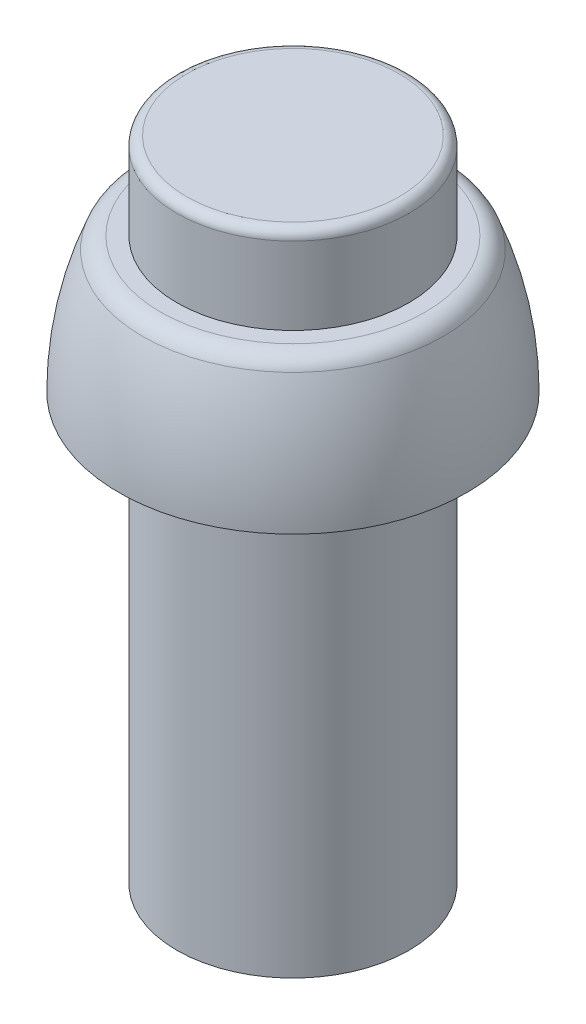
ISO-10303-21;
HEADER;
FILE_DESCRIPTION(('STEP AP214'),'2;1');
FILE_NAME('part.step','',(''),(''),'','','');
FILE_SCHEMA(('AUTOMOTIVE_DESIGN { 1 0 10303 214 1 1 1 1 }'));
ENDSEC;
DATA;
#1=APPLICATION_CONTEXT('core data for automotive mechanical design processes');
#2=APPLICATION_PROTOCOL_DEFINITION('international standard','automotive_design',2000,#1);
#3=PRODUCT_CONTEXT('',#1,'mechanical');
#4=PRODUCT('Part','Part','',(#3));
#5=PRODUCT_RELATED_PRODUCT_CATEGORY('part','',(#4));
#6=PRODUCT_DEFINITION_FORMATION('','',#4);
#7=PRODUCT_DEFINITION_CONTEXT('part definition',#1,'design');
#8=PRODUCT_DEFINITION('design','',#6,#7);
#9=PRODUCT_DEFINITION_SHAPE('','',#8);
#10=(LENGTH_UNIT() NAMED_UNIT(*) SI_UNIT(.MILLI.,.METRE.));
#11=(NAMED_UNIT(*) PLANE_ANGLE_UNIT() SI_UNIT($,.RADIAN.));
#12=(NAMED_UNIT(*) SI_UNIT($,.STERADIAN.) SOLID_ANGLE_UNIT());
#13=UNCERTAINTY_MEASURE_WITH_UNIT(LENGTH_MEASURE(1.E-05),#10,'distance_accuracy_value','');
#14=(GEOMETRIC_REPRESENTATION_CONTEXT(3) GLOBAL_UNCERTAINTY_ASSIGNED_CONTEXT((#13)) GLOBAL_UNIT_ASSIGNED_CONTEXT((#10,
#11,#12)) REPRESENTATION_CONTEXT('',''));
#15=CARTESIAN_POINT('',(0.,0.,0.));
#16=DIRECTION('',(0.,0.,1.));
#17=DIRECTION('',(1.,0.,0.));
#18=AXIS2_PLACEMENT_3D('',#15,#16,#17);
#19=CARTESIAN_POINT('',(0.,-22.,0.));
#20=DIRECTION('',(0.,1.,0.));
#21=DIRECTION('',(0.,0.,1.));
#22=AXIS2_PLACEMENT_3D('',#19,#20,#21);
#23=CYLINDRICAL_SURFACE('',#22,6.);
#24=CARTESIAN_POINT('',(0.,-22.,0.));
#25=DIRECTION('',(0.,1.,0.));
#26=DIRECTION('',(0.,0.,1.));
#27=AXIS2_PLACEMENT_3D('',#24,#25,#26);
#28=CIRCLE('',#27,6.);
#29=CARTESIAN_POINT('',(0.,-22.,6.));
#30=VERTEX_POINT('',#29);
#31=EDGE_CURVE('E73',#30,#30,#28,.T.);
#32=ORIENTED_EDGE('',*,*,#31,.T.);
#33=EDGE_LOOP('',(#32));
#34=FACE_BOUND('',#33,.T.);
#35=CARTESIAN_POINT('',(0.,0.,0.));
#36=DIRECTION('',(0.,1.,0.));
#37=DIRECTION('',(0.,0.,1.));
#38=AXIS2_PLACEMENT_3D('',#35,#36,#37);
#39=CIRCLE('',#38,6.);
#40=CARTESIAN_POINT('',(0.,0.,6.));
#41=VERTEX_POINT('',#40);
#42=EDGE_CURVE('E78',#41,#41,#39,.T.);
#43=ORIENTED_EDGE('',*,*,#42,.F.);
#44=EDGE_LOOP('',(#43));
#45=FACE_BOUND('',#44,.T.);
#46=ADVANCED_FACE('F50',(#34,#45),#23,.T.);
#47=CARTESIAN_POINT('',(0.,-22.,0.));
#48=DIRECTION('',(0.,1.,0.));
#49=DIRECTION('',(0.,0.,1.));
#50=AXIS2_PLACEMENT_3D('',#47,#48,#49);
#51=PLANE('',#50);
#52=ORIENTED_EDGE('',*,*,#31,.F.);
#53=EDGE_LOOP('',(#52));
#54=FACE_BOUND('',#53,.T.);
#55=ADVANCED_FACE('F105',(#54),#51,.F.);
#56=CARTESIAN_POINT('',(0.,0.,0.));
#57=DIRECTION('',(0.,-1.,0.));
#58=DIRECTION('',(0.,0.,-1.));
#59=AXIS2_PLACEMENT_3D('',#56,#57,#58);
#60=PLANE('',#59);
#61=ORIENTED_EDGE('',*,*,#42,.T.);
#62=EDGE_LOOP('',(#61));
#63=FACE_BOUND('',#62,.T.);
#64=CARTESIAN_POINT('',(0.,0.,0.));
#65=DIRECTION('',(0.,-1.,0.));
#66=DIRECTION('',(0.,0.,-1.));
#67=AXIS2_PLACEMENT_3D('',#64,#65,#66);
#68=CIRCLE('',#67,9.);
#69=CARTESIAN_POINT('',(0.,0.,-9.));
#70=VERTEX_POINT('',#69);
#71=EDGE_CURVE('E77',#70,#70,#68,.T.);
#72=ORIENTED_EDGE('',*,*,#71,.T.);
#73=EDGE_LOOP('',(#72));
#74=FACE_BOUND('',#73,.T.);
#75=ADVANCED_FACE('F86',(#63,#74),#60,.T.);
#76=CARTESIAN_POINT('',(0.,0.,0.));
#77=DIRECTION('',(0.,-1.,0.));
#78=DIRECTION('',(0.,0.,-1.));
#79=AXIS2_PLACEMENT_3D('',#76,#77,#78);
#80=DEGENERATE_TOROIDAL_SURFACE('',#79,8.08333333333334,17.0833333333333,.F.);
#81=CARTESIAN_POINT('',(0.,6.37305699481865,0.));
#82=DIRECTION('',(0.,-1.,0.));
#83=DIRECTION('',(0.,0.,-1.));
#84=AXIS2_PLACEMENT_3D('',#81,#82,#83);
#85=CIRCLE('',#84,7.76672730751504);
#86=CARTESIAN_POINT('',(0.,6.37305699481865,-7.76672730751504));
#87=VERTEX_POINT('',#86);
#88=EDGE_CURVE('E72',#87,#87,#85,.T.);
#89=ORIENTED_EDGE('',*,*,#88,.T.);
#90=EDGE_LOOP('',(#89));
#91=FACE_BOUND('',#90,.T.);
#92=ORIENTED_EDGE('',*,*,#71,.F.);
#93=EDGE_LOOP('',(#92));
#94=FACE_BOUND('',#93,.T.);
#95=ADVANCED_FACE('F89',(#91,#94),#80,.F.);
#96=CARTESIAN_POINT('',(0.,7.,0.));
#97=DIRECTION('',(0.,1.,0.));
#98=DIRECTION('',(0.,0.,1.));
#99=AXIS2_PLACEMENT_3D('',#96,#97,#98);
#100=PLANE('',#99);
#101=CARTESIAN_POINT('',(0.,7.,0.));
#102=DIRECTION('',(0.,1.,0.));
#103=DIRECTION('',(0.,0.,1.));
#104=AXIS2_PLACEMENT_3D('',#101,#102,#103);
#105=CIRCLE('',#104,6.);
#106=CARTESIAN_POINT('',(0.,7.,6.));
#107=VERTEX_POINT('',#106);
#108=EDGE_CURVE('E58',#107,#107,#105,.T.);
#109=ORIENTED_EDGE('',*,*,#108,.F.);
#110=EDGE_LOOP('',(#109));
#111=FACE_BOUND('',#110,.T.);
#112=CARTESIAN_POINT('',(0.,7.,0.));
#113=DIRECTION('',(0.,1.,0.));
#114=DIRECTION('',(0.,0.,1.));
#115=AXIS2_PLACEMENT_3D('',#112,#113,#114);
#116=CIRCLE('',#115,6.83891887975806);
#117=CARTESIAN_POINT('',(0.,7.,6.83891887975806));
#118=VERTEX_POINT('',#117);
#119=EDGE_CURVE('E62',#118,#118,#116,.T.);
#120=ORIENTED_EDGE('',*,*,#119,.T.);
#121=EDGE_LOOP('',(#120));
#122=FACE_BOUND('',#121,.T.);
#123=ADVANCED_FACE('F95',(#111,#122),#100,.T.);
#124=CARTESIAN_POINT('',(0.,6.,0.));
#125=DIRECTION('',(0.,1.,0.));
#126=DIRECTION('',(0.,0.,1.));
#127=AXIS2_PLACEMENT_3D('',#124,#125,#126);
#128=TOROIDAL_SURFACE('',#127,6.83891887975806,1.);
#129=ORIENTED_EDGE('',*,*,#119,.F.);
#130=EDGE_LOOP('',(#129));
#131=FACE_BOUND('',#130,.T.);
#132=ORIENTED_EDGE('',*,*,#88,.F.);
#133=EDGE_LOOP('',(#132));
#134=FACE_BOUND('',#133,.T.);
#135=ADVANCED_FACE('F97',(#131,#134),#128,.T.);
#136=CARTESIAN_POINT('',(0.,11.5,0.));
#137=DIRECTION('',(0.,1.,0.));
#138=DIRECTION('',(0.,0.,1.));
#139=AXIS2_PLACEMENT_3D('',#136,#137,#138);
#140=PLANE('',#139);
#141=CARTESIAN_POINT('',(0.,11.5,0.));
#142=DIRECTION('',(0.,1.,0.));
#143=DIRECTION('',(0.,0.,1.));
#144=AXIS2_PLACEMENT_3D('',#141,#142,#143);
#145=CIRCLE('',#144,5.5);
#146=CARTESIAN_POINT('',(0.,11.5,5.5));
#147=VERTEX_POINT('',#146);
#148=EDGE_CURVE('E10',#147,#147,#145,.T.);
#149=ORIENTED_EDGE('',*,*,#148,.T.);
#150=EDGE_LOOP('',(#149));
#151=FACE_BOUND('',#150,.T.);
#152=ADVANCED_FACE('F113',(#151),#140,.T.);
#153=CARTESIAN_POINT('',(0.,7.,0.));
#154=DIRECTION('',(0.,-1.,0.));
#155=DIRECTION('',(0.,0.,-1.));
#156=AXIS2_PLACEMENT_3D('',#153,#154,#155);
#157=CYLINDRICAL_SURFACE('',#156,6.);
#158=CARTESIAN_POINT('',(0.,11.,0.));
#159=DIRECTION('',(0.,1.,0.));
#160=DIRECTION('',(0.,0.,1.));
#161=AXIS2_PLACEMENT_3D('',#158,#159,#160);
#162=CIRCLE('',#161,6.);
#163=CARTESIAN_POINT('',(0.,11.,6.));
#164=VERTEX_POINT('',#163);
#165=EDGE_CURVE('E54',#164,#164,#162,.F.);
#166=ORIENTED_EDGE('',*,*,#165,.T.);
#167=EDGE_LOOP('',(#166));
#168=FACE_BOUND('',#167,.T.);
#169=ORIENTED_EDGE('',*,*,#108,.T.);
#170=EDGE_LOOP('',(#169));
#171=FACE_BOUND('',#170,.T.);
#172=ADVANCED_FACE('F117',(#168,#171),#157,.T.);
#173=CARTESIAN_POINT('',(0.,11.,0.));
#174=DIRECTION('',(0.,1.,0.));
#175=DIRECTION('',(0.,0.,1.));
#176=AXIS2_PLACEMENT_3D('',#173,#174,#175);
#177=TOROIDAL_SURFACE('',#176,5.5,0.5);
#178=ORIENTED_EDGE('',*,*,#148,.F.);
#179=EDGE_LOOP('',(#178));
#180=FACE_BOUND('',#179,.T.);
#181=ORIENTED_EDGE('',*,*,#165,.F.);
#182=EDGE_LOOP('',(#181));
#183=FACE_BOUND('',#182,.T.);
#184=ADVANCED_FACE('F47',(#180,#183),#177,.T.);
#185=CLOSED_SHELL('',(#46,#55,#75,#95,#123,#135,#152,#172,#184));
#186=MANIFOLD_SOLID_BREP('B2',#185);
#187=ADVANCED_BREP_SHAPE_REPRESENTATION('',(#18,#186),#14);
#188=SHAPE_DEFINITION_REPRESENTATION(#9,#187);
ENDSEC;
END-ISO-10303-21;
